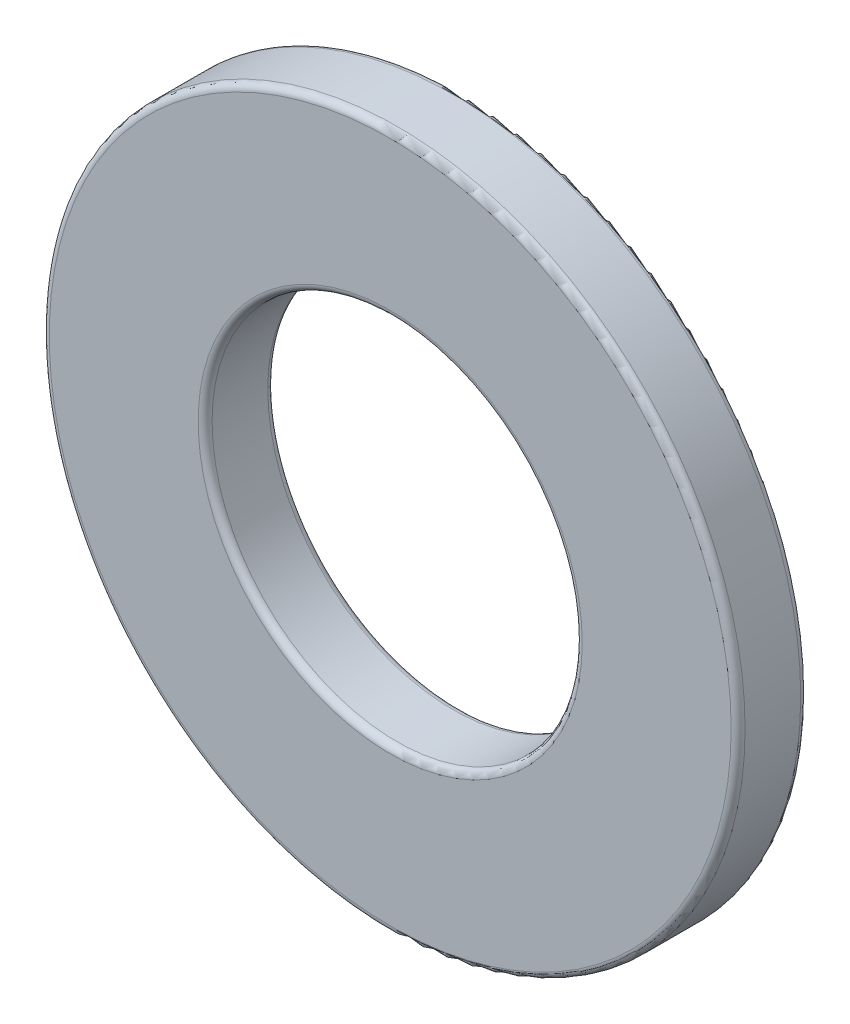
ISO-10303-21;
HEADER;
FILE_DESCRIPTION(('STEP AP214'),'2;1');
FILE_NAME('part.step','',(''),(''),'','','');
FILE_SCHEMA(('AUTOMOTIVE_DESIGN { 1 0 10303 214 1 1 1 1 }'));
ENDSEC;
DATA;
#1=APPLICATION_CONTEXT('core data for automotive mechanical design processes');
#2=APPLICATION_PROTOCOL_DEFINITION('international standard','automotive_design',2000,#1);
#3=PRODUCT_CONTEXT('',#1,'mechanical');
#4=PRODUCT('Part','Part','',(#3));
#5=PRODUCT_RELATED_PRODUCT_CATEGORY('part','',(#4));
#6=PRODUCT_DEFINITION_FORMATION('','',#4);
#7=PRODUCT_DEFINITION_CONTEXT('part definition',#1,'design');
#8=PRODUCT_DEFINITION('design','',#6,#7);
#9=PRODUCT_DEFINITION_SHAPE('','',#8);
#10=(LENGTH_UNIT() NAMED_UNIT(*) SI_UNIT(.MILLI.,.METRE.));
#11=(NAMED_UNIT(*) PLANE_ANGLE_UNIT() SI_UNIT($,.RADIAN.));
#12=(NAMED_UNIT(*) SI_UNIT($,.STERADIAN.) SOLID_ANGLE_UNIT());
#13=UNCERTAINTY_MEASURE_WITH_UNIT(LENGTH_MEASURE(1.E-05),#10,'distance_accuracy_value','');
#14=(GEOMETRIC_REPRESENTATION_CONTEXT(3) GLOBAL_UNCERTAINTY_ASSIGNED_CONTEXT((#13)) GLOBAL_UNIT_ASSIGNED_CONTEXT((#10,
#11,#12)) REPRESENTATION_CONTEXT('',''));
#15=CARTESIAN_POINT('',(0.,0.,0.));
#16=DIRECTION('',(0.,0.,1.));
#17=DIRECTION('',(1.,0.,0.));
#18=AXIS2_PLACEMENT_3D('',#15,#16,#17);
#19=CARTESIAN_POINT('',(0.,0.,-0.635000000000003));
#20=DIRECTION('',(0.,0.,1.));
#21=DIRECTION('',(1.,0.,0.));
#22=AXIS2_PLACEMENT_3D('',#19,#20,#21);
#23=CYLINDRICAL_SURFACE('',#22,6.35);
#24=CARTESIAN_POINT('',(0.,0.,0.508000000000002));
#25=DIRECTION('',(0.,0.,1.));
#26=DIRECTION('',(1.,0.,0.));
#27=AXIS2_PLACEMENT_3D('',#24,#25,#26);
#28=CIRCLE('',#27,6.35);
#29=CARTESIAN_POINT('',(6.35,0.,0.508000000000002));
#30=VERTEX_POINT('',#29);
#31=EDGE_CURVE('E10',#30,#30,#28,.F.);
#32=ORIENTED_EDGE('',*,*,#31,.T.);
#33=EDGE_LOOP('',(#32));
#34=FACE_BOUND('',#33,.T.);
#35=CARTESIAN_POINT('',(0.,0.,-0.508000000000003));
#36=DIRECTION('',(0.,0.,1.));
#37=DIRECTION('',(1.,0.,0.));
#38=AXIS2_PLACEMENT_3D('',#35,#36,#37);
#39=CIRCLE('',#38,6.35);
#40=CARTESIAN_POINT('',(6.35,0.,-0.508000000000003));
#41=VERTEX_POINT('',#40);
#42=EDGE_CURVE('E43',#41,#41,#39,.T.);
#43=ORIENTED_EDGE('',*,*,#42,.T.);
#44=EDGE_LOOP('',(#43));
#45=FACE_BOUND('',#44,.T.);
#46=ADVANCED_FACE('F36',(#34,#45),#23,.T.);
#47=CARTESIAN_POINT('',(0.,0.,-0.635000000000003));
#48=DIRECTION('',(0.,0.,1.));
#49=DIRECTION('',(1.,0.,0.));
#50=AXIS2_PLACEMENT_3D('',#47,#48,#49);
#51=PLANE('',#50);
#52=CARTESIAN_POINT('',(0.,0.,-0.635000000000003));
#53=DIRECTION('',(0.,0.,1.));
#54=DIRECTION('',(1.,0.,0.));
#55=AXIS2_PLACEMENT_3D('',#52,#53,#54);
#56=CIRCLE('',#55,3.5052);
#57=CARTESIAN_POINT('',(3.5052,0.,-0.635000000000003));
#58=VERTEX_POINT('',#57);
#59=EDGE_CURVE('E47',#58,#58,#56,.T.);
#60=ORIENTED_EDGE('',*,*,#59,.T.);
#61=EDGE_LOOP('',(#60));
#62=FACE_BOUND('',#61,.T.);
#63=CARTESIAN_POINT('',(0.,0.,-0.635000000000003));
#64=DIRECTION('',(0.,0.,1.));
#65=DIRECTION('',(1.,0.,0.));
#66=AXIS2_PLACEMENT_3D('',#63,#64,#65);
#67=CIRCLE('',#66,6.223);
#68=CARTESIAN_POINT('',(6.223,0.,-0.635000000000003));
#69=VERTEX_POINT('',#68);
#70=EDGE_CURVE('E51',#69,#69,#67,.F.);
#71=ORIENTED_EDGE('',*,*,#70,.T.);
#72=EDGE_LOOP('',(#71));
#73=FACE_BOUND('',#72,.T.);
#74=ADVANCED_FACE('F79',(#62,#73),#51,.F.);
#75=CARTESIAN_POINT('',(0.,0.,0.635000000000002));
#76=DIRECTION('',(0.,0.,1.));
#77=DIRECTION('',(1.,0.,0.));
#78=AXIS2_PLACEMENT_3D('',#75,#76,#77);
#79=PLANE('',#78);
#80=CARTESIAN_POINT('',(0.,0.,0.635000000000002));
#81=DIRECTION('',(0.,0.,1.));
#82=DIRECTION('',(1.,0.,0.));
#83=AXIS2_PLACEMENT_3D('',#80,#81,#82);
#84=CIRCLE('',#83,3.5052);
#85=CARTESIAN_POINT('',(3.5052,0.,0.635000000000002));
#86=VERTEX_POINT('',#85);
#87=EDGE_CURVE('E56',#86,#86,#84,.F.);
#88=ORIENTED_EDGE('',*,*,#87,.T.);
#89=EDGE_LOOP('',(#88));
#90=FACE_BOUND('',#89,.T.);
#91=CARTESIAN_POINT('',(0.,0.,0.635000000000002));
#92=DIRECTION('',(0.,0.,1.));
#93=DIRECTION('',(1.,0.,0.));
#94=AXIS2_PLACEMENT_3D('',#91,#92,#93);
#95=CIRCLE('',#94,6.223);
#96=CARTESIAN_POINT('',(6.223,0.,0.635000000000002));
#97=VERTEX_POINT('',#96);
#98=EDGE_CURVE('E59',#97,#97,#95,.T.);
#99=ORIENTED_EDGE('',*,*,#98,.T.);
#100=EDGE_LOOP('',(#99));
#101=FACE_BOUND('',#100,.T.);
#102=ADVANCED_FACE('F82',(#90,#101),#79,.T.);
#103=CARTESIAN_POINT('',(0.,0.,-0.635000000000003));
#104=DIRECTION('',(0.,0.,1.));
#105=DIRECTION('',(1.,0.,0.));
#106=AXIS2_PLACEMENT_3D('',#103,#104,#105);
#107=CYLINDRICAL_SURFACE('',#106,3.3782);
#108=CARTESIAN_POINT('',(0.,0.,0.508000000000002));
#109=DIRECTION('',(0.,0.,1.));
#110=DIRECTION('',(1.,0.,0.));
#111=AXIS2_PLACEMENT_3D('',#108,#109,#110);
#112=CIRCLE('',#111,3.3782);
#113=CARTESIAN_POINT('',(3.3782,0.,0.508000000000002));
#114=VERTEX_POINT('',#113);
#115=EDGE_CURVE('E62',#114,#114,#112,.T.);
#116=ORIENTED_EDGE('',*,*,#115,.T.);
#117=EDGE_LOOP('',(#116));
#118=FACE_BOUND('',#117,.T.);
#119=CARTESIAN_POINT('',(0.,0.,-0.508000000000003));
#120=DIRECTION('',(0.,0.,1.));
#121=DIRECTION('',(1.,0.,0.));
#122=AXIS2_PLACEMENT_3D('',#119,#120,#121);
#123=CIRCLE('',#122,3.3782);
#124=CARTESIAN_POINT('',(3.3782,0.,-0.508000000000003));
#125=VERTEX_POINT('',#124);
#126=EDGE_CURVE('E65',#125,#125,#123,.F.);
#127=ORIENTED_EDGE('',*,*,#126,.T.);
#128=EDGE_LOOP('',(#127));
#129=FACE_BOUND('',#128,.T.);
#130=ADVANCED_FACE('F69',(#118,#129),#107,.F.);
#131=CARTESIAN_POINT('',(0.,0.,0.508000000000002));
#132=DIRECTION('',(0.,0.,1.));
#133=DIRECTION('',(1.,0.,0.));
#134=AXIS2_PLACEMENT_3D('',#131,#132,#133);
#135=TOROIDAL_SURFACE('',#134,3.5052,0.127);
#136=ORIENTED_EDGE('',*,*,#87,.F.);
#137=EDGE_LOOP('',(#136));
#138=FACE_BOUND('',#137,.T.);
#139=ORIENTED_EDGE('',*,*,#115,.F.);
#140=EDGE_LOOP('',(#139));
#141=FACE_BOUND('',#140,.T.);
#142=ADVANCED_FACE('F75',(#138,#141),#135,.T.);
#143=CARTESIAN_POINT('',(0.,0.,-0.508000000000003));
#144=DIRECTION('',(0.,0.,1.));
#145=DIRECTION('',(1.,0.,0.));
#146=AXIS2_PLACEMENT_3D('',#143,#144,#145);
#147=TOROIDAL_SURFACE('',#146,3.5052,0.127);
#148=ORIENTED_EDGE('',*,*,#126,.F.);
#149=EDGE_LOOP('',(#148));
#150=FACE_BOUND('',#149,.T.);
#151=ORIENTED_EDGE('',*,*,#59,.F.);
#152=EDGE_LOOP('',(#151));
#153=FACE_BOUND('',#152,.T.);
#154=ADVANCED_FACE('F71',(#150,#153),#147,.T.);
#155=CARTESIAN_POINT('',(0.,0.,0.508000000000002));
#156=DIRECTION('',(0.,0.,1.));
#157=DIRECTION('',(1.,0.,0.));
#158=AXIS2_PLACEMENT_3D('',#155,#156,#157);
#159=TOROIDAL_SURFACE('',#158,6.223,0.127);
#160=ORIENTED_EDGE('',*,*,#31,.F.);
#161=EDGE_LOOP('',(#160));
#162=FACE_BOUND('',#161,.T.);
#163=ORIENTED_EDGE('',*,*,#98,.F.);
#164=EDGE_LOOP('',(#163));
#165=FACE_BOUND('',#164,.T.);
#166=ADVANCED_FACE('F74',(#162,#165),#159,.T.);
#167=CARTESIAN_POINT('',(0.,0.,-0.508000000000003));
#168=DIRECTION('',(0.,0.,1.));
#169=DIRECTION('',(1.,0.,0.));
#170=AXIS2_PLACEMENT_3D('',#167,#168,#169);
#171=TOROIDAL_SURFACE('',#170,6.223,0.127);
#172=ORIENTED_EDGE('',*,*,#70,.F.);
#173=EDGE_LOOP('',(#172));
#174=FACE_BOUND('',#173,.T.);
#175=ORIENTED_EDGE('',*,*,#42,.F.);
#176=EDGE_LOOP('',(#175));
#177=FACE_BOUND('',#176,.T.);
#178=ADVANCED_FACE('F38',(#174,#177),#171,.T.);
#179=CLOSED_SHELL('',(#46,#74,#102,#130,#142,#154,#166,#178));
#180=MANIFOLD_SOLID_BREP('B2',#179);
#181=ADVANCED_BREP_SHAPE_REPRESENTATION('',(#18,#180),#14);
#182=SHAPE_DEFINITION_REPRESENTATION(#9,#181);
ENDSEC;
END-ISO-10303-21;
